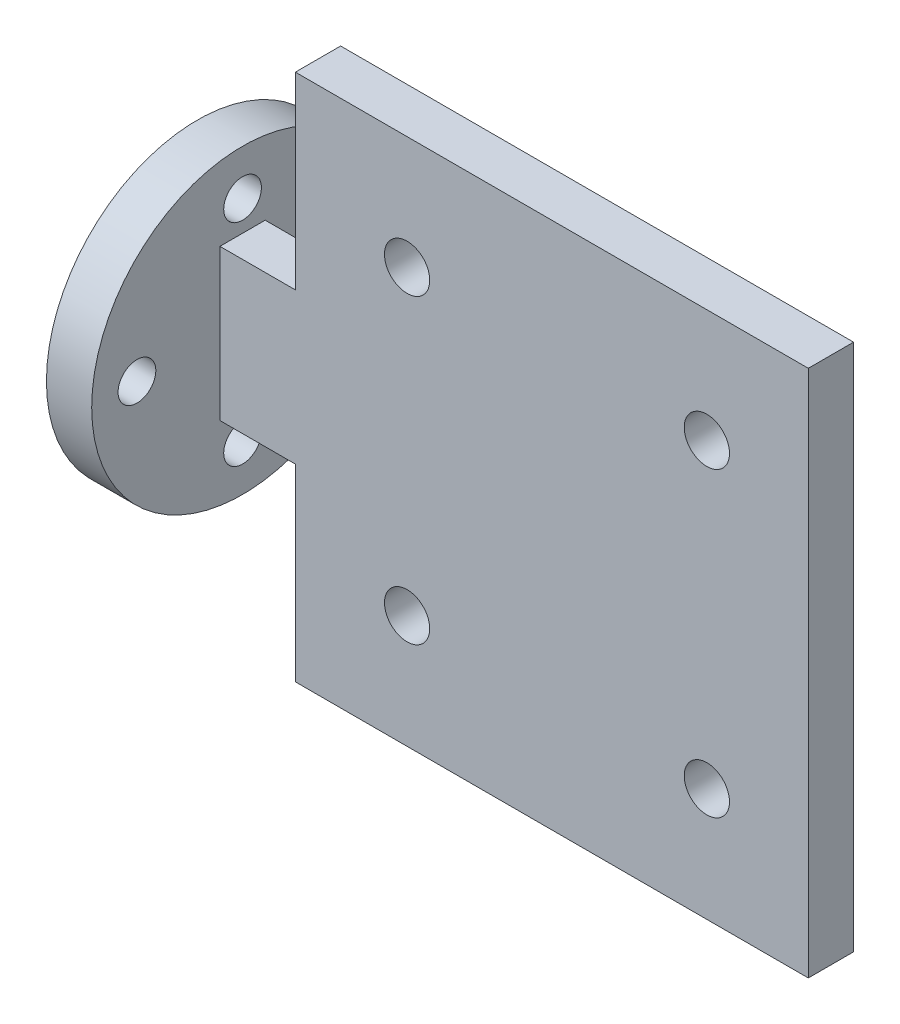
ISO-10303-21;
HEADER;
FILE_DESCRIPTION(('STEP AP214'),'2;1');
FILE_NAME('part.step','',(''),(''),'','','');
FILE_SCHEMA(('AUTOMOTIVE_DESIGN { 1 0 10303 214 1 1 1 1 }'));
ENDSEC;
DATA;
#1=APPLICATION_CONTEXT('core data for automotive mechanical design processes');
#2=APPLICATION_PROTOCOL_DEFINITION('international standard','automotive_design',2000,#1);
#3=PRODUCT_CONTEXT('',#1,'mechanical');
#4=PRODUCT('Part','Part','',(#3));
#5=PRODUCT_RELATED_PRODUCT_CATEGORY('part','',(#4));
#6=PRODUCT_DEFINITION_FORMATION('','',#4);
#7=PRODUCT_DEFINITION_CONTEXT('part definition',#1,'design');
#8=PRODUCT_DEFINITION('design','',#6,#7);
#9=PRODUCT_DEFINITION_SHAPE('','',#8);
#10=(LENGTH_UNIT() NAMED_UNIT(*) SI_UNIT(.MILLI.,.METRE.));
#11=(NAMED_UNIT(*) PLANE_ANGLE_UNIT() SI_UNIT($,.RADIAN.));
#12=(NAMED_UNIT(*) SI_UNIT($,.STERADIAN.) SOLID_ANGLE_UNIT());
#13=UNCERTAINTY_MEASURE_WITH_UNIT(LENGTH_MEASURE(1.E-05),#10,'distance_accuracy_value','');
#14=(GEOMETRIC_REPRESENTATION_CONTEXT(3) GLOBAL_UNCERTAINTY_ASSIGNED_CONTEXT((#13)) GLOBAL_UNIT_ASSIGNED_CONTEXT((#10,
#11,#12)) REPRESENTATION_CONTEXT('',''));
#15=CARTESIAN_POINT('',(0.,0.,0.));
#16=DIRECTION('',(0.,0.,1.));
#17=DIRECTION('',(1.,0.,0.));
#18=AXIS2_PLACEMENT_3D('',#15,#16,#17);
#19=CARTESIAN_POINT('',(-17.,-17.5,3.));
#20=DIRECTION('',(1.,0.,0.));
#21=DIRECTION('',(0.,0.,-1.));
#22=AXIS2_PLACEMENT_3D('',#19,#20,#21);
#23=PLANE('',#22);
#24=DIRECTION('',(0.,0.,1.));
#25=VECTOR('',#24,1.);
#26=CARTESIAN_POINT('',(-17.,-5.,0.));
#27=LINE('',#26,#25);
#28=CARTESIAN_POINT('',(-17.,-5.,0.));
#29=VERTEX_POINT('',#28);
#30=CARTESIAN_POINT('',(-17.,-5.,3.));
#31=VERTEX_POINT('',#30);
#32=EDGE_CURVE('E135',#29,#31,#27,.T.);
#33=ORIENTED_EDGE('',*,*,#32,.F.);
#34=DIRECTION('',(0.,-1.,0.));
#35=VECTOR('',#34,1.);
#36=CARTESIAN_POINT('',(-17.,-17.5,0.));
#37=LINE('',#36,#35);
#38=CARTESIAN_POINT('',(-17.,-17.5,0.));
#39=VERTEX_POINT('',#38);
#40=EDGE_CURVE('E169',#29,#39,#37,.T.);
#41=ORIENTED_EDGE('',*,*,#40,.T.);
#42=DIRECTION('',(0.,0.,-1.));
#43=VECTOR('',#42,1.);
#44=CARTESIAN_POINT('',(-17.,-17.5,3.));
#45=LINE('',#44,#43);
#46=CARTESIAN_POINT('',(-17.,-17.5,3.));
#47=VERTEX_POINT('',#46);
#48=EDGE_CURVE('E11',#47,#39,#45,.T.);
#49=ORIENTED_EDGE('',*,*,#48,.F.);
#50=DIRECTION('',(0.,-1.,0.));
#51=VECTOR('',#50,1.);
#52=CARTESIAN_POINT('',(-17.,-17.5,3.));
#53=LINE('',#52,#51);
#54=EDGE_CURVE('E98',#31,#47,#53,.T.);
#55=ORIENTED_EDGE('',*,*,#54,.F.);
#56=EDGE_LOOP('',(#33,#41,#49,#55));
#57=FACE_BOUND('',#56,.T.);
#58=ADVANCED_FACE('F45',(#57),#23,.F.);
#59=CARTESIAN_POINT('',(-17.,17.5,0.));
#60=VERTEX_POINT('',#59);
#61=CARTESIAN_POINT('',(-17.,5.,0.));
#62=VERTEX_POINT('',#61);
#63=EDGE_CURVE('E164',#60,#62,#37,.T.);
#64=ORIENTED_EDGE('',*,*,#63,.T.);
#65=DIRECTION('',(0.,0.,1.));
#66=VECTOR('',#65,1.);
#67=CARTESIAN_POINT('',(-17.,5.,0.));
#68=LINE('',#67,#66);
#69=CARTESIAN_POINT('',(-17.,5.,3.));
#70=VERTEX_POINT('',#69);
#71=EDGE_CURVE('E145',#62,#70,#68,.T.);
#72=ORIENTED_EDGE('',*,*,#71,.T.);
#73=CARTESIAN_POINT('',(-17.,17.5,3.));
#74=VERTEX_POINT('',#73);
#75=EDGE_CURVE('E152',#74,#70,#53,.T.);
#76=ORIENTED_EDGE('',*,*,#75,.F.);
#77=DIRECTION('',(0.,0.,-1.));
#78=VECTOR('',#77,1.);
#79=CARTESIAN_POINT('',(-17.,17.5,3.));
#80=LINE('',#79,#78);
#81=EDGE_CURVE('E163',#74,#60,#80,.T.);
#82=ORIENTED_EDGE('',*,*,#81,.T.);
#83=EDGE_LOOP('',(#64,#72,#76,#82));
#84=FACE_BOUND('',#83,.T.);
#85=ADVANCED_FACE('F47',(#84),#23,.F.);
#86=CARTESIAN_POINT('',(17.,-17.5,3.));
#87=DIRECTION('',(0.,1.,0.));
#88=DIRECTION('',(0.,0.,1.));
#89=AXIS2_PLACEMENT_3D('',#86,#87,#88);
#90=PLANE('',#89);
#91=DIRECTION('',(1.,0.,0.));
#92=VECTOR('',#91,1.);
#93=CARTESIAN_POINT('',(17.,-17.5,0.));
#94=LINE('',#93,#92);
#95=CARTESIAN_POINT('',(17.,-17.5,0.));
#96=VERTEX_POINT('',#95);
#97=EDGE_CURVE('E168',#39,#96,#94,.T.);
#98=ORIENTED_EDGE('',*,*,#97,.T.);
#99=DIRECTION('',(0.,0.,-1.));
#100=VECTOR('',#99,1.);
#101=CARTESIAN_POINT('',(17.,-17.5,3.));
#102=LINE('',#101,#100);
#103=CARTESIAN_POINT('',(17.,-17.5,3.));
#104=VERTEX_POINT('',#103);
#105=EDGE_CURVE('E54',#104,#96,#102,.T.);
#106=ORIENTED_EDGE('',*,*,#105,.F.);
#107=DIRECTION('',(1.,0.,0.));
#108=VECTOR('',#107,1.);
#109=CARTESIAN_POINT('',(17.,-17.5,3.));
#110=LINE('',#109,#108);
#111=EDGE_CURVE('E155',#47,#104,#110,.T.);
#112=ORIENTED_EDGE('',*,*,#111,.F.);
#113=ORIENTED_EDGE('',*,*,#48,.T.);
#114=EDGE_LOOP('',(#98,#106,#112,#113));
#115=FACE_BOUND('',#114,.T.);
#116=ADVANCED_FACE('F207',(#115),#90,.F.);
#117=CARTESIAN_POINT('',(17.,-17.5,3.));
#118=DIRECTION('',(-1.,0.,0.));
#119=DIRECTION('',(0.,0.,1.));
#120=AXIS2_PLACEMENT_3D('',#117,#118,#119);
#121=PLANE('',#120);
#122=DIRECTION('',(0.,1.,0.));
#123=VECTOR('',#122,1.);
#124=CARTESIAN_POINT('',(17.,-17.5,0.));
#125=LINE('',#124,#123);
#126=CARTESIAN_POINT('',(17.,17.5,0.));
#127=VERTEX_POINT('',#126);
#128=EDGE_CURVE('E172',#96,#127,#125,.T.);
#129=ORIENTED_EDGE('',*,*,#128,.T.);
#130=DIRECTION('',(0.,0.,-1.));
#131=VECTOR('',#130,1.);
#132=CARTESIAN_POINT('',(17.,17.5,3.));
#133=LINE('',#132,#131);
#134=CARTESIAN_POINT('',(17.,17.5,3.));
#135=VERTEX_POINT('',#134);
#136=EDGE_CURVE('E179',#135,#127,#133,.T.);
#137=ORIENTED_EDGE('',*,*,#136,.F.);
#138=DIRECTION('',(0.,1.,0.));
#139=VECTOR('',#138,1.);
#140=CARTESIAN_POINT('',(17.,-17.5,3.));
#141=LINE('',#140,#139);
#142=EDGE_CURVE('E158',#104,#135,#141,.T.);
#143=ORIENTED_EDGE('',*,*,#142,.F.);
#144=ORIENTED_EDGE('',*,*,#105,.T.);
#145=EDGE_LOOP('',(#129,#137,#143,#144));
#146=FACE_BOUND('',#145,.T.);
#147=ADVANCED_FACE('F187',(#146),#121,.F.);
#148=CARTESIAN_POINT('',(17.,17.5,3.));
#149=DIRECTION('',(0.,-1.,0.));
#150=DIRECTION('',(1.,0.,0.));
#151=AXIS2_PLACEMENT_3D('',#148,#149,#150);
#152=PLANE('',#151);
#153=DIRECTION('',(-1.,0.,0.));
#154=VECTOR('',#153,1.);
#155=CARTESIAN_POINT('',(17.,17.5,0.));
#156=LINE('',#155,#154);
#157=EDGE_CURVE('E91',#127,#60,#156,.T.);
#158=ORIENTED_EDGE('',*,*,#157,.T.);
#159=ORIENTED_EDGE('',*,*,#81,.F.);
#160=DIRECTION('',(-1.,0.,0.));
#161=VECTOR('',#160,1.);
#162=CARTESIAN_POINT('',(17.,17.5,3.));
#163=LINE('',#162,#161);
#164=EDGE_CURVE('E70',#135,#74,#163,.T.);
#165=ORIENTED_EDGE('',*,*,#164,.F.);
#166=ORIENTED_EDGE('',*,*,#136,.T.);
#167=EDGE_LOOP('',(#158,#159,#165,#166));
#168=FACE_BOUND('',#167,.T.);
#169=ADVANCED_FACE('F198',(#168),#152,.F.);
#170=CARTESIAN_POINT('',(0.,0.,3.));
#171=DIRECTION('',(0.,0.,1.));
#172=DIRECTION('',(1.,0.,0.));
#173=AXIS2_PLACEMENT_3D('',#170,#171,#172);
#174=PLANE('',#173);
#175=CARTESIAN_POINT('',(10.2751582396487,-10.,3.));
#176=DIRECTION('',(0.,0.,1.));
#177=DIRECTION('',(1.,0.,0.));
#178=AXIS2_PLACEMENT_3D('',#175,#176,#177);
#179=CIRCLE('',#178,1.5);
#180=CARTESIAN_POINT('',(11.7751582396487,-10.,3.));
#181=VERTEX_POINT('',#180);
#182=EDGE_CURVE('E280',#181,#181,#179,.T.);
#183=ORIENTED_EDGE('',*,*,#182,.F.);
#184=EDGE_LOOP('',(#183));
#185=FACE_BOUND('',#184,.T.);
#186=CARTESIAN_POINT('',(-9.59363137479316,10.,3.));
#187=DIRECTION('',(0.,0.,1.));
#188=DIRECTION('',(1.,0.,0.));
#189=AXIS2_PLACEMENT_3D('',#186,#187,#188);
#190=CIRCLE('',#189,1.5);
#191=CARTESIAN_POINT('',(-8.09363137479316,10.,3.));
#192=VERTEX_POINT('',#191);
#193=EDGE_CURVE('E288',#192,#192,#190,.T.);
#194=ORIENTED_EDGE('',*,*,#193,.F.);
#195=EDGE_LOOP('',(#194));
#196=FACE_BOUND('',#195,.T.);
#197=CARTESIAN_POINT('',(-9.59363137479316,-10.,3.));
#198=DIRECTION('',(0.,0.,1.));
#199=DIRECTION('',(1.,0.,0.));
#200=AXIS2_PLACEMENT_3D('',#197,#198,#199);
#201=CIRCLE('',#200,1.5);
#202=CARTESIAN_POINT('',(-8.09363137479316,-10.,3.));
#203=VERTEX_POINT('',#202);
#204=EDGE_CURVE('E289',#203,#203,#201,.T.);
#205=ORIENTED_EDGE('',*,*,#204,.F.);
#206=EDGE_LOOP('',(#205));
#207=FACE_BOUND('',#206,.T.);
#208=CARTESIAN_POINT('',(10.2751582396487,10.,3.));
#209=DIRECTION('',(0.,0.,1.));
#210=DIRECTION('',(1.,0.,0.));
#211=AXIS2_PLACEMENT_3D('',#208,#209,#210);
#212=CIRCLE('',#211,1.5);
#213=CARTESIAN_POINT('',(11.7751582396487,10.,3.));
#214=VERTEX_POINT('',#213);
#215=EDGE_CURVE('E276',#214,#214,#212,.T.);
#216=ORIENTED_EDGE('',*,*,#215,.F.);
#217=EDGE_LOOP('',(#216));
#218=FACE_BOUND('',#217,.T.);
#219=ORIENTED_EDGE('',*,*,#75,.T.);
#220=DIRECTION('',(-1.,0.,0.));
#221=VECTOR('',#220,1.);
#222=CARTESIAN_POINT('',(0.,5.,3.));
#223=LINE('',#222,#221);
#224=CARTESIAN_POINT('',(-22.,5.,3.));
#225=VERTEX_POINT('',#224);
#226=EDGE_CURVE('E61',#70,#225,#223,.T.);
#227=ORIENTED_EDGE('',*,*,#226,.T.);
#228=DIRECTION('',(0.,1.,0.));
#229=VECTOR('',#228,1.);
#230=CARTESIAN_POINT('',(-22.,0.,3.));
#231=LINE('',#230,#229);
#232=CARTESIAN_POINT('',(-22.,-5.,3.));
#233=VERTEX_POINT('',#232);
#234=EDGE_CURVE('E119',#233,#225,#231,.T.);
#235=ORIENTED_EDGE('',*,*,#234,.F.);
#236=DIRECTION('',(-1.,0.,0.));
#237=VECTOR('',#236,1.);
#238=CARTESIAN_POINT('',(0.,-5.,3.));
#239=LINE('',#238,#237);
#240=EDGE_CURVE('E122',#31,#233,#239,.T.);
#241=ORIENTED_EDGE('',*,*,#240,.F.);
#242=ORIENTED_EDGE('',*,*,#54,.T.);
#243=ORIENTED_EDGE('',*,*,#111,.T.);
#244=ORIENTED_EDGE('',*,*,#142,.T.);
#245=ORIENTED_EDGE('',*,*,#164,.T.);
#246=EDGE_LOOP('',(#219,#227,#235,#241,#242,#243,#244,#245));
#247=FACE_BOUND('',#246,.T.);
#248=ADVANCED_FACE('F121',(#185,#196,#207,#218,#247),#174,.T.);
#249=CARTESIAN_POINT('',(0.,0.,0.));
#250=DIRECTION('',(0.,0.,1.));
#251=DIRECTION('',(1.,0.,0.));
#252=AXIS2_PLACEMENT_3D('',#249,#250,#251);
#253=PLANE('',#252);
#254=CARTESIAN_POINT('',(10.2751582396487,-10.,0.));
#255=DIRECTION('',(0.,0.,1.));
#256=DIRECTION('',(1.,0.,0.));
#257=AXIS2_PLACEMENT_3D('',#254,#255,#256);
#258=CIRCLE('',#257,1.5);
#259=CARTESIAN_POINT('',(11.7751582396487,-10.,0.));
#260=VERTEX_POINT('',#259);
#261=EDGE_CURVE('E293',#260,#260,#258,.T.);
#262=ORIENTED_EDGE('',*,*,#261,.T.);
#263=EDGE_LOOP('',(#262));
#264=FACE_BOUND('',#263,.T.);
#265=CARTESIAN_POINT('',(-9.59363137479316,10.,0.));
#266=DIRECTION('',(0.,0.,1.));
#267=DIRECTION('',(1.,0.,0.));
#268=AXIS2_PLACEMENT_3D('',#265,#266,#267);
#269=CIRCLE('',#268,1.5);
#270=CARTESIAN_POINT('',(-8.09363137479316,10.,0.));
#271=VERTEX_POINT('',#270);
#272=EDGE_CURVE('E284',#271,#271,#269,.T.);
#273=ORIENTED_EDGE('',*,*,#272,.T.);
#274=EDGE_LOOP('',(#273));
#275=FACE_BOUND('',#274,.T.);
#276=CARTESIAN_POINT('',(-9.59363137479316,-10.,0.));
#277=DIRECTION('',(0.,0.,1.));
#278=DIRECTION('',(1.,0.,0.));
#279=AXIS2_PLACEMENT_3D('',#276,#277,#278);
#280=CIRCLE('',#279,1.5);
#281=CARTESIAN_POINT('',(-8.09363137479316,-10.,0.));
#282=VERTEX_POINT('',#281);
#283=EDGE_CURVE('E300',#282,#282,#280,.T.);
#284=ORIENTED_EDGE('',*,*,#283,.T.);
#285=EDGE_LOOP('',(#284));
#286=FACE_BOUND('',#285,.T.);
#287=CARTESIAN_POINT('',(10.2751582396487,10.,0.));
#288=DIRECTION('',(0.,0.,1.));
#289=DIRECTION('',(1.,0.,0.));
#290=AXIS2_PLACEMENT_3D('',#287,#288,#289);
#291=CIRCLE('',#290,1.5);
#292=CARTESIAN_POINT('',(11.7751582396487,10.,0.));
#293=VERTEX_POINT('',#292);
#294=EDGE_CURVE('E272',#293,#293,#291,.T.);
#295=ORIENTED_EDGE('',*,*,#294,.T.);
#296=EDGE_LOOP('',(#295));
#297=FACE_BOUND('',#296,.T.);
#298=ORIENTED_EDGE('',*,*,#63,.F.);
#299=ORIENTED_EDGE('',*,*,#157,.F.);
#300=ORIENTED_EDGE('',*,*,#128,.F.);
#301=ORIENTED_EDGE('',*,*,#97,.F.);
#302=ORIENTED_EDGE('',*,*,#40,.F.);
#303=DIRECTION('',(-1.,0.,0.));
#304=VECTOR('',#303,1.);
#305=CARTESIAN_POINT('',(0.,-5.,0.));
#306=LINE('',#305,#304);
#307=CARTESIAN_POINT('',(-22.,-5.,0.));
#308=VERTEX_POINT('',#307);
#309=EDGE_CURVE('E148',#29,#308,#306,.T.);
#310=ORIENTED_EDGE('',*,*,#309,.T.);
#311=DIRECTION('',(0.,1.,0.));
#312=VECTOR('',#311,1.);
#313=CARTESIAN_POINT('',(-22.,0.,0.));
#314=LINE('',#313,#312);
#315=CARTESIAN_POINT('',(-22.,5.,0.));
#316=VERTEX_POINT('',#315);
#317=EDGE_CURVE('E139',#308,#316,#314,.T.);
#318=ORIENTED_EDGE('',*,*,#317,.T.);
#319=DIRECTION('',(-1.,0.,0.));
#320=VECTOR('',#319,1.);
#321=CARTESIAN_POINT('',(0.,5.,0.));
#322=LINE('',#321,#320);
#323=EDGE_CURVE('E141',#62,#316,#322,.T.);
#324=ORIENTED_EDGE('',*,*,#323,.F.);
#325=EDGE_LOOP('',(#298,#299,#300,#301,#302,#310,#318,#324));
#326=FACE_BOUND('',#325,.T.);
#327=ADVANCED_FACE('F193',(#264,#275,#286,#297,#326),#253,.F.);
#328=CARTESIAN_POINT('',(0.,5.,0.));
#329=DIRECTION('',(0.,1.,0.));
#330=DIRECTION('',(-1.,0.,0.));
#331=AXIS2_PLACEMENT_3D('',#328,#329,#330);
#332=PLANE('',#331);
#333=ORIENTED_EDGE('',*,*,#226,.F.);
#334=ORIENTED_EDGE('',*,*,#71,.F.);
#335=ORIENTED_EDGE('',*,*,#323,.T.);
#336=DIRECTION('',(0.,0.,1.));
#337=VECTOR('',#336,1.);
#338=CARTESIAN_POINT('',(-22.,5.,0.));
#339=LINE('',#338,#337);
#340=EDGE_CURVE('E217',#316,#225,#339,.T.);
#341=ORIENTED_EDGE('',*,*,#340,.T.);
#342=EDGE_LOOP('',(#333,#334,#335,#341));
#343=FACE_BOUND('',#342,.T.);
#344=ADVANCED_FACE('F362',(#343),#332,.T.);
#345=CARTESIAN_POINT('',(0.,-5.,0.));
#346=DIRECTION('',(0.,1.,0.));
#347=DIRECTION('',(-1.,0.,0.));
#348=AXIS2_PLACEMENT_3D('',#345,#346,#347);
#349=PLANE('',#348);
#350=ORIENTED_EDGE('',*,*,#240,.T.);
#351=DIRECTION('',(0.,0.,1.));
#352=VECTOR('',#351,1.);
#353=CARTESIAN_POINT('',(-22.,-5.,0.));
#354=LINE('',#353,#352);
#355=EDGE_CURVE('E132',#308,#233,#354,.T.);
#356=ORIENTED_EDGE('',*,*,#355,.F.);
#357=ORIENTED_EDGE('',*,*,#309,.F.);
#358=ORIENTED_EDGE('',*,*,#32,.T.);
#359=EDGE_LOOP('',(#350,#356,#357,#358));
#360=FACE_BOUND('',#359,.T.);
#361=ADVANCED_FACE('F131',(#360),#349,.F.);
#362=CARTESIAN_POINT('',(-22.,0.,1.5));
#363=DIRECTION('',(-1.,0.,0.));
#364=DIRECTION('',(0.,0.,1.));
#365=AXIS2_PLACEMENT_3D('',#362,#363,#364);
#366=PLANE('',#365);
#367=CARTESIAN_POINT('',(-22.,6.99999999999999,1.5));
#368=DIRECTION('',(-1.,0.,0.));
#369=DIRECTION('',(0.,0.,1.));
#370=AXIS2_PLACEMENT_3D('',#367,#368,#369);
#371=CIRCLE('',#370,1.25);
#372=CARTESIAN_POINT('',(-22.,6.99999999999999,2.75));
#373=VERTEX_POINT('',#372);
#374=EDGE_CURVE('E232',#373,#373,#371,.T.);
#375=ORIENTED_EDGE('',*,*,#374,.T.);
#376=EDGE_LOOP('',(#375));
#377=FACE_BOUND('',#376,.T.);
#378=CARTESIAN_POINT('',(-22.,1.65882932390282E-13,8.5000000000002));
#379=DIRECTION('',(-1.,0.,0.));
#380=DIRECTION('',(0.,0.,1.));
#381=AXIS2_PLACEMENT_3D('',#378,#379,#380);
#382=CIRCLE('',#381,1.25);
#383=CARTESIAN_POINT('',(-22.,1.65882932390282E-13,9.7500000000002));
#384=VERTEX_POINT('',#383);
#385=EDGE_CURVE('E253',#384,#384,#382,.T.);
#386=ORIENTED_EDGE('',*,*,#385,.T.);
#387=EDGE_LOOP('',(#386));
#388=FACE_BOUND('',#387,.T.);
#389=CARTESIAN_POINT('',(-22.,-7.00000000000001,1.50000000000035));
#390=DIRECTION('',(-1.,0.,0.));
#391=DIRECTION('',(0.,0.,1.));
#392=AXIS2_PLACEMENT_3D('',#389,#390,#391);
#393=CIRCLE('',#392,1.25);
#394=CARTESIAN_POINT('',(-22.,-7.00000000000001,2.75000000000035));
#395=VERTEX_POINT('',#394);
#396=EDGE_CURVE('E245',#395,#395,#393,.T.);
#397=ORIENTED_EDGE('',*,*,#396,.T.);
#398=EDGE_LOOP('',(#397));
#399=FACE_BOUND('',#398,.T.);
#400=CARTESIAN_POINT('',(-22.,-1.30971622436249E-13,-5.4999999999998));
#401=DIRECTION('',(-1.,0.,0.));
#402=DIRECTION('',(0.,0.,1.));
#403=AXIS2_PLACEMENT_3D('',#400,#401,#402);
#404=CIRCLE('',#403,1.25);
#405=CARTESIAN_POINT('',(-22.,-1.30971622436249E-13,-4.2499999999998));
#406=VERTEX_POINT('',#405);
#407=EDGE_CURVE('E236',#406,#406,#404,.T.);
#408=ORIENTED_EDGE('',*,*,#407,.T.);
#409=EDGE_LOOP('',(#408));
#410=FACE_BOUND('',#409,.T.);
#411=CARTESIAN_POINT('',(-22.,0.,1.5));
#412=DIRECTION('',(-1.,0.,0.));
#413=DIRECTION('',(0.,0.,1.));
#414=AXIS2_PLACEMENT_3D('',#411,#412,#413);
#415=CIRCLE('',#414,10.);
#416=CARTESIAN_POINT('',(-22.,0.,11.5));
#417=VERTEX_POINT('',#416);
#418=EDGE_CURVE('E228',#417,#417,#415,.T.);
#419=ORIENTED_EDGE('',*,*,#418,.F.);
#420=EDGE_LOOP('',(#419));
#421=FACE_BOUND('',#420,.T.);
#422=ORIENTED_EDGE('',*,*,#355,.T.);
#423=ORIENTED_EDGE('',*,*,#234,.T.);
#424=ORIENTED_EDGE('',*,*,#340,.F.);
#425=ORIENTED_EDGE('',*,*,#317,.F.);
#426=EDGE_LOOP('',(#422,#423,#424,#425));
#427=FACE_BOUND('',#426,.T.);
#428=ADVANCED_FACE('F138',(#377,#388,#399,#410,#421,#427),#366,.F.);
#429=CARTESIAN_POINT('',(-25.,0.,1.5));
#430=DIRECTION('',(1.,0.,0.));
#431=DIRECTION('',(0.,0.,-1.));
#432=AXIS2_PLACEMENT_3D('',#429,#430,#431);
#433=CYLINDRICAL_SURFACE('',#432,10.);
#434=CARTESIAN_POINT('',(-25.,0.,1.5));
#435=DIRECTION('',(-1.,0.,0.));
#436=DIRECTION('',(0.,0.,1.));
#437=AXIS2_PLACEMENT_3D('',#434,#435,#436);
#438=CIRCLE('',#437,10.);
#439=CARTESIAN_POINT('',(-25.,0.,11.5));
#440=VERTEX_POINT('',#439);
#441=EDGE_CURVE('E127',#440,#440,#438,.T.);
#442=ORIENTED_EDGE('',*,*,#441,.F.);
#443=EDGE_LOOP('',(#442));
#444=FACE_BOUND('',#443,.T.);
#445=ORIENTED_EDGE('',*,*,#418,.T.);
#446=EDGE_LOOP('',(#445));
#447=FACE_BOUND('',#446,.T.);
#448=ADVANCED_FACE('F354',(#444,#447),#433,.T.);
#449=CARTESIAN_POINT('',(-25.,0.,1.5));
#450=DIRECTION('',(-1.,0.,0.));
#451=DIRECTION('',(0.,0.,1.));
#452=AXIS2_PLACEMENT_3D('',#449,#450,#451);
#453=PLANE('',#452);
#454=CARTESIAN_POINT('',(-25.,0.,1.5));
#455=DIRECTION('',(-1.,0.,0.));
#456=DIRECTION('',(0.,0.,1.));
#457=AXIS2_PLACEMENT_3D('',#454,#455,#456);
#458=CIRCLE('',#457,1.75);
#459=CARTESIAN_POINT('',(-25.,0.,3.25));
#460=VERTEX_POINT('',#459);
#461=EDGE_CURVE('E268',#460,#460,#458,.T.);
#462=ORIENTED_EDGE('',*,*,#461,.F.);
#463=EDGE_LOOP('',(#462));
#464=FACE_BOUND('',#463,.T.);
#465=CARTESIAN_POINT('',(-25.,6.99999999999999,1.5));
#466=DIRECTION('',(-1.,0.,0.));
#467=DIRECTION('',(0.,0.,1.));
#468=AXIS2_PLACEMENT_3D('',#465,#466,#467);
#469=CIRCLE('',#468,1.25);
#470=CARTESIAN_POINT('',(-25.,6.99999999999999,2.75));
#471=VERTEX_POINT('',#470);
#472=EDGE_CURVE('E261',#471,#471,#469,.T.);
#473=ORIENTED_EDGE('',*,*,#472,.F.);
#474=EDGE_LOOP('',(#473));
#475=FACE_BOUND('',#474,.T.);
#476=CARTESIAN_POINT('',(-25.,1.65882932390282E-13,8.5000000000002));
#477=DIRECTION('',(-1.,0.,0.));
#478=DIRECTION('',(0.,0.,1.));
#479=AXIS2_PLACEMENT_3D('',#476,#477,#478);
#480=CIRCLE('',#479,1.25);
#481=CARTESIAN_POINT('',(-25.,1.65882932390282E-13,9.7500000000002));
#482=VERTEX_POINT('',#481);
#483=EDGE_CURVE('E257',#482,#482,#480,.T.);
#484=ORIENTED_EDGE('',*,*,#483,.F.);
#485=EDGE_LOOP('',(#484));
#486=FACE_BOUND('',#485,.T.);
#487=CARTESIAN_POINT('',(-25.,-7.00000000000001,1.50000000000035));
#488=DIRECTION('',(-1.,0.,0.));
#489=DIRECTION('',(0.,0.,1.));
#490=AXIS2_PLACEMENT_3D('',#487,#488,#489);
#491=CIRCLE('',#490,1.25);
#492=CARTESIAN_POINT('',(-25.,-7.00000000000001,2.75000000000035));
#493=VERTEX_POINT('',#492);
#494=EDGE_CURVE('E249',#493,#493,#491,.T.);
#495=ORIENTED_EDGE('',*,*,#494,.F.);
#496=EDGE_LOOP('',(#495));
#497=FACE_BOUND('',#496,.T.);
#498=CARTESIAN_POINT('',(-25.,-1.30971622436249E-13,-5.4999999999998));
#499=DIRECTION('',(-1.,0.,0.));
#500=DIRECTION('',(0.,0.,1.));
#501=AXIS2_PLACEMENT_3D('',#498,#499,#500);
#502=CIRCLE('',#501,1.25);
#503=CARTESIAN_POINT('',(-25.,-1.30971622436249E-13,-4.2499999999998));
#504=VERTEX_POINT('',#503);
#505=EDGE_CURVE('E240',#504,#504,#502,.T.);
#506=ORIENTED_EDGE('',*,*,#505,.F.);
#507=EDGE_LOOP('',(#506));
#508=FACE_BOUND('',#507,.T.);
#509=ORIENTED_EDGE('',*,*,#441,.T.);
#510=EDGE_LOOP('',(#509));
#511=FACE_BOUND('',#510,.T.);
#512=ADVANCED_FACE('F350',(#464,#475,#486,#497,#508,#511),#453,.T.);
#513=CARTESIAN_POINT('',(-22.,-1.30971622436249E-13,-5.4999999999998));
#514=DIRECTION('',(-1.,0.,0.));
#515=DIRECTION('',(0.,0.,1.));
#516=AXIS2_PLACEMENT_3D('',#513,#514,#515);
#517=CYLINDRICAL_SURFACE('',#516,1.25);
#518=ORIENTED_EDGE('',*,*,#407,.F.);
#519=EDGE_LOOP('',(#518));
#520=FACE_BOUND('',#519,.T.);
#521=ORIENTED_EDGE('',*,*,#505,.T.);
#522=EDGE_LOOP('',(#521));
#523=FACE_BOUND('',#522,.T.);
#524=ADVANCED_FACE('F346',(#520,#523),#517,.F.);
#525=CARTESIAN_POINT('',(-22.,-7.00000000000001,1.50000000000035));
#526=DIRECTION('',(-1.,0.,0.));
#527=DIRECTION('',(0.,0.,1.));
#528=AXIS2_PLACEMENT_3D('',#525,#526,#527);
#529=CYLINDRICAL_SURFACE('',#528,1.25);
#530=ORIENTED_EDGE('',*,*,#396,.F.);
#531=EDGE_LOOP('',(#530));
#532=FACE_BOUND('',#531,.T.);
#533=ORIENTED_EDGE('',*,*,#494,.T.);
#534=EDGE_LOOP('',(#533));
#535=FACE_BOUND('',#534,.T.);
#536=ADVANCED_FACE('F342',(#532,#535),#529,.F.);
#537=CARTESIAN_POINT('',(-22.,1.65882932390282E-13,8.5000000000002));
#538=DIRECTION('',(-1.,0.,0.));
#539=DIRECTION('',(0.,0.,1.));
#540=AXIS2_PLACEMENT_3D('',#537,#538,#539);
#541=CYLINDRICAL_SURFACE('',#540,1.25);
#542=ORIENTED_EDGE('',*,*,#385,.F.);
#543=EDGE_LOOP('',(#542));
#544=FACE_BOUND('',#543,.T.);
#545=ORIENTED_EDGE('',*,*,#483,.T.);
#546=EDGE_LOOP('',(#545));
#547=FACE_BOUND('',#546,.T.);
#548=ADVANCED_FACE('F338',(#544,#547),#541,.F.);
#549=CARTESIAN_POINT('',(-22.,6.99999999999999,1.5));
#550=DIRECTION('',(-1.,0.,0.));
#551=DIRECTION('',(0.,0.,1.));
#552=AXIS2_PLACEMENT_3D('',#549,#550,#551);
#553=CYLINDRICAL_SURFACE('',#552,1.25);
#554=ORIENTED_EDGE('',*,*,#374,.F.);
#555=EDGE_LOOP('',(#554));
#556=FACE_BOUND('',#555,.T.);
#557=ORIENTED_EDGE('',*,*,#472,.T.);
#558=EDGE_LOOP('',(#557));
#559=FACE_BOUND('',#558,.T.);
#560=ADVANCED_FACE('F334',(#556,#559),#553,.F.);
#561=CARTESIAN_POINT('',(-23.5,0.,1.5));
#562=DIRECTION('',(-1.,0.,0.));
#563=DIRECTION('',(0.,0.,1.));
#564=AXIS2_PLACEMENT_3D('',#561,#562,#563);
#565=CYLINDRICAL_SURFACE('',#564,1.75);
#566=CARTESIAN_POINT('',(-23.5,0.,1.5));
#567=DIRECTION('',(-1.,0.,0.));
#568=DIRECTION('',(0.,0.,1.));
#569=AXIS2_PLACEMENT_3D('',#566,#567,#568);
#570=CIRCLE('',#569,1.75);
#571=CARTESIAN_POINT('',(-23.5,0.,3.25));
#572=VERTEX_POINT('',#571);
#573=EDGE_CURVE('E241',#572,#572,#570,.T.);
#574=ORIENTED_EDGE('',*,*,#573,.F.);
#575=EDGE_LOOP('',(#574));
#576=FACE_BOUND('',#575,.T.);
#577=ORIENTED_EDGE('',*,*,#461,.T.);
#578=EDGE_LOOP('',(#577));
#579=FACE_BOUND('',#578,.T.);
#580=ADVANCED_FACE('F325',(#576,#579),#565,.F.);
#581=CARTESIAN_POINT('',(-23.5,0.,1.5));
#582=DIRECTION('',(-1.,0.,0.));
#583=DIRECTION('',(0.,0.,1.));
#584=AXIS2_PLACEMENT_3D('',#581,#582,#583);
#585=PLANE('',#584);
#586=ORIENTED_EDGE('',*,*,#573,.T.);
#587=EDGE_LOOP('',(#586));
#588=FACE_BOUND('',#587,.T.);
#589=ADVANCED_FACE('F315',(#588),#585,.T.);
#590=CARTESIAN_POINT('',(10.2751582396487,10.,0.));
#591=DIRECTION('',(0.,0.,1.));
#592=DIRECTION('',(1.,0.,0.));
#593=AXIS2_PLACEMENT_3D('',#590,#591,#592);
#594=CYLINDRICAL_SURFACE('',#593,1.5);
#595=ORIENTED_EDGE('',*,*,#294,.F.);
#596=EDGE_LOOP('',(#595));
#597=FACE_BOUND('',#596,.T.);
#598=ORIENTED_EDGE('',*,*,#215,.T.);
#599=EDGE_LOOP('',(#598));
#600=FACE_BOUND('',#599,.T.);
#601=ADVANCED_FACE('F313',(#597,#600),#594,.F.);
#602=CARTESIAN_POINT('',(-9.59363137479316,-10.,0.));
#603=DIRECTION('',(0.,0.,1.));
#604=DIRECTION('',(1.,0.,0.));
#605=AXIS2_PLACEMENT_3D('',#602,#603,#604);
#606=CYLINDRICAL_SURFACE('',#605,1.5);
#607=ORIENTED_EDGE('',*,*,#283,.F.);
#608=EDGE_LOOP('',(#607));
#609=FACE_BOUND('',#608,.T.);
#610=ORIENTED_EDGE('',*,*,#204,.T.);
#611=EDGE_LOOP('',(#610));
#612=FACE_BOUND('',#611,.T.);
#613=ADVANCED_FACE('F308',(#609,#612),#606,.F.);
#614=CARTESIAN_POINT('',(-9.59363137479316,10.,0.));
#615=DIRECTION('',(0.,0.,1.));
#616=DIRECTION('',(1.,0.,0.));
#617=AXIS2_PLACEMENT_3D('',#614,#615,#616);
#618=CYLINDRICAL_SURFACE('',#617,1.5);
#619=ORIENTED_EDGE('',*,*,#272,.F.);
#620=EDGE_LOOP('',(#619));
#621=FACE_BOUND('',#620,.T.);
#622=ORIENTED_EDGE('',*,*,#193,.T.);
#623=EDGE_LOOP('',(#622));
#624=FACE_BOUND('',#623,.T.);
#625=ADVANCED_FACE('F322',(#621,#624),#618,.F.);
#626=CARTESIAN_POINT('',(10.2751582396487,-10.,0.));
#627=DIRECTION('',(0.,0.,1.));
#628=DIRECTION('',(1.,0.,0.));
#629=AXIS2_PLACEMENT_3D('',#626,#627,#628);
#630=CYLINDRICAL_SURFACE('',#629,1.5);
#631=ORIENTED_EDGE('',*,*,#261,.F.);
#632=EDGE_LOOP('',(#631));
#633=FACE_BOUND('',#632,.T.);
#634=ORIENTED_EDGE('',*,*,#182,.T.);
#635=EDGE_LOOP('',(#634));
#636=FACE_BOUND('',#635,.T.);
#637=ADVANCED_FACE('F379',(#633,#636),#630,.F.);
#638=CLOSED_SHELL('',(#58,#85,#116,#147,#169,#248,#327,#344,#361,#428,#448,#512,#524,#536,#548,
#560,#580,#589,#601,#613,#625,#637));
#639=MANIFOLD_SOLID_BREP('B2',#638);
#640=ADVANCED_BREP_SHAPE_REPRESENTATION('',(#18,#639),#14);
#641=SHAPE_DEFINITION_REPRESENTATION(#9,#640);
ENDSEC;
END-ISO-10303-21;
